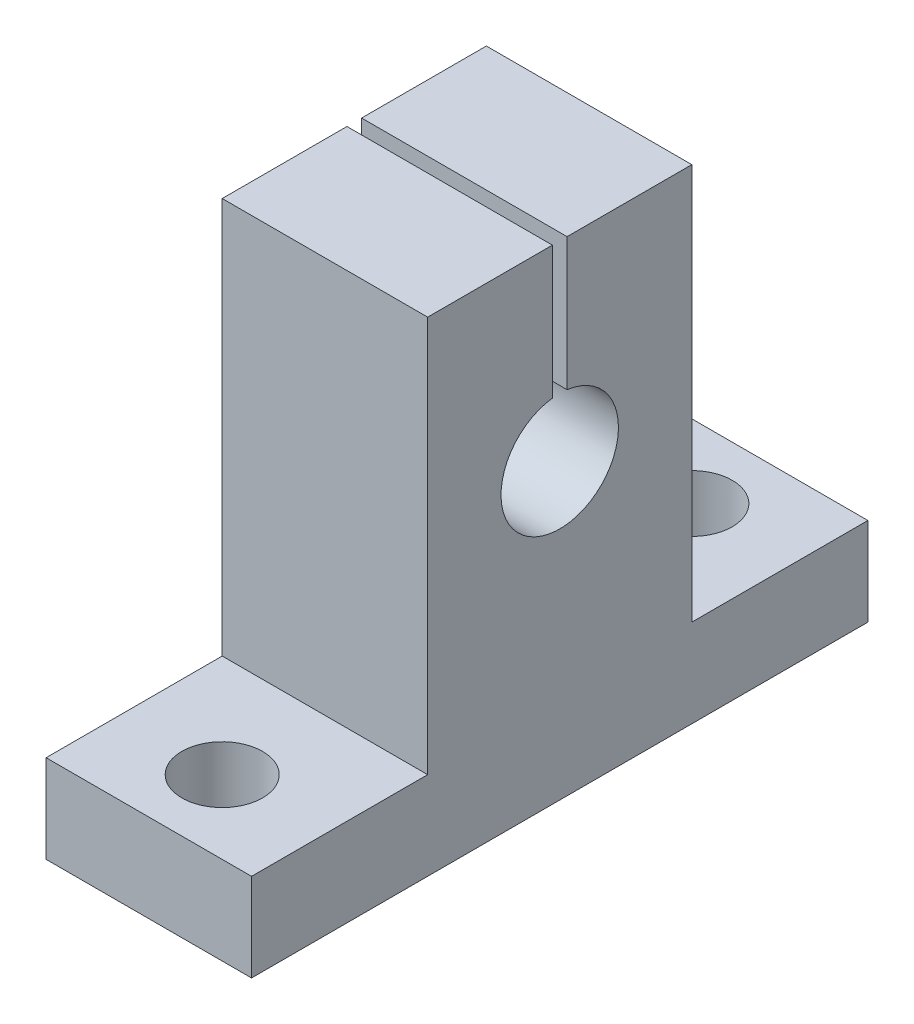
ISO-10303-21;
HEADER;
FILE_DESCRIPTION(('STEP AP214'),'2;1');
FILE_NAME('part.step','',(''),(''),'','','');
FILE_SCHEMA(('AUTOMOTIVE_DESIGN { 1 0 10303 214 1 1 1 1 }'));
ENDSEC;
DATA;
#1=APPLICATION_CONTEXT('core data for automotive mechanical design processes');
#2=APPLICATION_PROTOCOL_DEFINITION('international standard','automotive_design',2000,#1);
#3=PRODUCT_CONTEXT('',#1,'mechanical');
#4=PRODUCT('Part','Part','',(#3));
#5=PRODUCT_RELATED_PRODUCT_CATEGORY('part','',(#4));
#6=PRODUCT_DEFINITION_FORMATION('','',#4);
#7=PRODUCT_DEFINITION_CONTEXT('part definition',#1,'design');
#8=PRODUCT_DEFINITION('design','',#6,#7);
#9=PRODUCT_DEFINITION_SHAPE('','',#8);
#10=(LENGTH_UNIT() NAMED_UNIT(*) SI_UNIT(.MILLI.,.METRE.));
#11=(NAMED_UNIT(*) PLANE_ANGLE_UNIT() SI_UNIT($,.RADIAN.));
#12=(NAMED_UNIT(*) SI_UNIT($,.STERADIAN.) SOLID_ANGLE_UNIT());
#13=UNCERTAINTY_MEASURE_WITH_UNIT(LENGTH_MEASURE(1.E-05),#10,'distance_accuracy_value','');
#14=(GEOMETRIC_REPRESENTATION_CONTEXT(3) GLOBAL_UNCERTAINTY_ASSIGNED_CONTEXT((#13)) GLOBAL_UNIT_ASSIGNED_CONTEXT((#10,
#11,#12)) REPRESENTATION_CONTEXT('',''));
#15=CARTESIAN_POINT('',(0.,0.,0.));
#16=DIRECTION('',(0.,0.,1.));
#17=DIRECTION('',(1.,0.,0.));
#18=AXIS2_PLACEMENT_3D('',#15,#16,#17);
#19=CARTESIAN_POINT('',(14.,-20.,21.));
#20=DIRECTION('',(0.,0.,-1.));
#21=DIRECTION('',(-1.,0.,0.));
#22=AXIS2_PLACEMENT_3D('',#19,#20,#21);
#23=PLANE('',#22);
#24=DIRECTION('',(0.,-1.,0.));
#25=VECTOR('',#24,1.);
#26=CARTESIAN_POINT('',(0.,-20.,21.));
#27=LINE('',#26,#25);
#28=CARTESIAN_POINT('',(0.,-14.,21.));
#29=VERTEX_POINT('',#28);
#30=CARTESIAN_POINT('',(0.,-20.,21.));
#31=VERTEX_POINT('',#30);
#32=EDGE_CURVE('E154',#29,#31,#27,.T.);
#33=ORIENTED_EDGE('',*,*,#32,.T.);
#34=DIRECTION('',(-1.,0.,0.));
#35=VECTOR('',#34,1.);
#36=CARTESIAN_POINT('',(14.,-20.,21.));
#37=LINE('',#36,#35);
#38=CARTESIAN_POINT('',(14.,-20.,21.));
#39=VERTEX_POINT('',#38);
#40=EDGE_CURVE('E11',#39,#31,#37,.T.);
#41=ORIENTED_EDGE('',*,*,#40,.F.);
#42=DIRECTION('',(0.,-1.,0.));
#43=VECTOR('',#42,1.);
#44=CARTESIAN_POINT('',(14.,-20.,21.));
#45=LINE('',#44,#43);
#46=CARTESIAN_POINT('',(14.,-14.,21.));
#47=VERTEX_POINT('',#46);
#48=EDGE_CURVE('E176',#47,#39,#45,.T.);
#49=ORIENTED_EDGE('',*,*,#48,.F.);
#50=DIRECTION('',(-1.,0.,0.));
#51=VECTOR('',#50,1.);
#52=CARTESIAN_POINT('',(14.,-14.,21.));
#53=LINE('',#52,#51);
#54=EDGE_CURVE('E150',#47,#29,#53,.T.);
#55=ORIENTED_EDGE('',*,*,#54,.T.);
#56=EDGE_LOOP('',(#33,#41,#49,#55));
#57=FACE_BOUND('',#56,.T.);
#58=ADVANCED_FACE('F32',(#57),#23,.F.);
#59=CARTESIAN_POINT('',(14.,-20.,-21.));
#60=DIRECTION('',(0.,1.,0.));
#61=DIRECTION('',(0.,0.,1.));
#62=AXIS2_PLACEMENT_3D('',#59,#60,#61);
#63=PLANE('',#62);
#64=CARTESIAN_POINT('',(7.,-20.,-16.));
#65=DIRECTION('',(0.,1.,0.));
#66=DIRECTION('',(0.,0.,1.));
#67=AXIS2_PLACEMENT_3D('',#64,#65,#66);
#68=CIRCLE('',#67,2.75);
#69=CARTESIAN_POINT('',(7.,-20.,-13.25));
#70=VERTEX_POINT('',#69);
#71=EDGE_CURVE('E201',#70,#70,#68,.T.);
#72=ORIENTED_EDGE('',*,*,#71,.T.);
#73=EDGE_LOOP('',(#72));
#74=FACE_BOUND('',#73,.T.);
#75=CARTESIAN_POINT('',(7.,-20.,16.));
#76=DIRECTION('',(0.,1.,0.));
#77=DIRECTION('',(0.,0.,-1.));
#78=AXIS2_PLACEMENT_3D('',#75,#76,#77);
#79=CIRCLE('',#78,2.75);
#80=CARTESIAN_POINT('',(7.,-20.,13.25));
#81=VERTEX_POINT('',#80);
#82=EDGE_CURVE('E206',#81,#81,#79,.T.);
#83=ORIENTED_EDGE('',*,*,#82,.T.);
#84=EDGE_LOOP('',(#83));
#85=FACE_BOUND('',#84,.T.);
#86=DIRECTION('',(0.,0.,-1.));
#87=VECTOR('',#86,1.);
#88=CARTESIAN_POINT('',(0.,-20.,-21.));
#89=LINE('',#88,#87);
#90=CARTESIAN_POINT('',(0.,-20.,-21.));
#91=VERTEX_POINT('',#90);
#92=EDGE_CURVE('E157',#31,#91,#89,.T.);
#93=ORIENTED_EDGE('',*,*,#92,.T.);
#94=DIRECTION('',(-1.,0.,0.));
#95=VECTOR('',#94,1.);
#96=CARTESIAN_POINT('',(14.,-20.,-21.));
#97=LINE('',#96,#95);
#98=CARTESIAN_POINT('',(14.,-20.,-21.));
#99=VERTEX_POINT('',#98);
#100=EDGE_CURVE('E41',#99,#91,#97,.T.);
#101=ORIENTED_EDGE('',*,*,#100,.F.);
#102=DIRECTION('',(0.,0.,-1.));
#103=VECTOR('',#102,1.);
#104=CARTESIAN_POINT('',(14.,-20.,-21.));
#105=LINE('',#104,#103);
#106=EDGE_CURVE('E105',#39,#99,#105,.T.);
#107=ORIENTED_EDGE('',*,*,#106,.F.);
#108=ORIENTED_EDGE('',*,*,#40,.T.);
#109=EDGE_LOOP('',(#93,#101,#107,#108));
#110=FACE_BOUND('',#109,.T.);
#111=ADVANCED_FACE('F254',(#74,#85,#110),#63,.F.);
#112=CARTESIAN_POINT('',(14.,-20.,-21.));
#113=DIRECTION('',(0.,0.,1.));
#114=DIRECTION('',(1.,0.,0.));
#115=AXIS2_PLACEMENT_3D('',#112,#113,#114);
#116=PLANE('',#115);
#117=DIRECTION('',(0.,1.,0.));
#118=VECTOR('',#117,1.);
#119=CARTESIAN_POINT('',(0.,-20.,-21.));
#120=LINE('',#119,#118);
#121=CARTESIAN_POINT('',(0.,-14.,-21.));
#122=VERTEX_POINT('',#121);
#123=EDGE_CURVE('E159',#91,#122,#120,.T.);
#124=ORIENTED_EDGE('',*,*,#123,.T.);
#125=DIRECTION('',(-1.,0.,0.));
#126=VECTOR('',#125,1.);
#127=CARTESIAN_POINT('',(14.,-14.,-21.));
#128=LINE('',#127,#126);
#129=CARTESIAN_POINT('',(14.,-14.,-21.));
#130=VERTEX_POINT('',#129);
#131=EDGE_CURVE('E195',#130,#122,#128,.T.);
#132=ORIENTED_EDGE('',*,*,#131,.F.);
#133=DIRECTION('',(0.,1.,0.));
#134=VECTOR('',#133,1.);
#135=CARTESIAN_POINT('',(14.,-20.,-21.));
#136=LINE('',#135,#134);
#137=EDGE_CURVE('E215',#99,#130,#136,.T.);
#138=ORIENTED_EDGE('',*,*,#137,.F.);
#139=ORIENTED_EDGE('',*,*,#100,.T.);
#140=EDGE_LOOP('',(#124,#132,#138,#139));
#141=FACE_BOUND('',#140,.T.);
#142=ADVANCED_FACE('F258',(#141),#116,.F.);
#143=CARTESIAN_POINT('',(14.,-14.,-21.));
#144=DIRECTION('',(0.,-1.,0.));
#145=DIRECTION('',(0.,0.,-1.));
#146=AXIS2_PLACEMENT_3D('',#143,#144,#145);
#147=PLANE('',#146);
#148=CARTESIAN_POINT('',(7.,-14.,-16.));
#149=DIRECTION('',(0.,-1.,0.));
#150=DIRECTION('',(0.,0.,-1.));
#151=AXIS2_PLACEMENT_3D('',#148,#149,#150);
#152=CIRCLE('',#151,2.75);
#153=CARTESIAN_POINT('',(7.,-14.,-18.75));
#154=VERTEX_POINT('',#153);
#155=EDGE_CURVE('E35',#154,#154,#152,.T.);
#156=ORIENTED_EDGE('',*,*,#155,.T.);
#157=EDGE_LOOP('',(#156));
#158=FACE_BOUND('',#157,.T.);
#159=DIRECTION('',(0.,0.,1.));
#160=VECTOR('',#159,1.);
#161=CARTESIAN_POINT('',(0.,-14.,-21.));
#162=LINE('',#161,#160);
#163=CARTESIAN_POINT('',(0.,-14.,-9.));
#164=VERTEX_POINT('',#163);
#165=EDGE_CURVE('E161',#122,#164,#162,.T.);
#166=ORIENTED_EDGE('',*,*,#165,.T.);
#167=DIRECTION('',(-1.,0.,0.));
#168=VECTOR('',#167,1.);
#169=CARTESIAN_POINT('',(14.,-14.,-9.));
#170=LINE('',#169,#168);
#171=CARTESIAN_POINT('',(14.,-14.,-9.));
#172=VERTEX_POINT('',#171);
#173=EDGE_CURVE('E192',#172,#164,#170,.T.);
#174=ORIENTED_EDGE('',*,*,#173,.F.);
#175=DIRECTION('',(0.,0.,1.));
#176=VECTOR('',#175,1.);
#177=CARTESIAN_POINT('',(14.,-14.,-21.));
#178=LINE('',#177,#176);
#179=EDGE_CURVE('E217',#130,#172,#178,.T.);
#180=ORIENTED_EDGE('',*,*,#179,.F.);
#181=ORIENTED_EDGE('',*,*,#131,.T.);
#182=EDGE_LOOP('',(#166,#174,#180,#181));
#183=FACE_BOUND('',#182,.T.);
#184=ADVANCED_FACE('F262',(#158,#183),#147,.F.);
#185=CARTESIAN_POINT('',(14.,-14.,-9.));
#186=DIRECTION('',(0.,0.,1.));
#187=DIRECTION('',(1.,0.,0.));
#188=AXIS2_PLACEMENT_3D('',#185,#186,#187);
#189=PLANE('',#188);
#190=DIRECTION('',(0.,1.,0.));
#191=VECTOR('',#190,1.);
#192=CARTESIAN_POINT('',(0.,-14.,-9.));
#193=LINE('',#192,#191);
#194=CARTESIAN_POINT('',(0.,13.,-9.));
#195=VERTEX_POINT('',#194);
#196=EDGE_CURVE('E163',#164,#195,#193,.T.);
#197=ORIENTED_EDGE('',*,*,#196,.T.);
#198=DIRECTION('',(-1.,0.,0.));
#199=VECTOR('',#198,1.);
#200=CARTESIAN_POINT('',(14.,13.,-9.));
#201=LINE('',#200,#199);
#202=CARTESIAN_POINT('',(14.,13.,-9.));
#203=VERTEX_POINT('',#202);
#204=EDGE_CURVE('E189',#203,#195,#201,.T.);
#205=ORIENTED_EDGE('',*,*,#204,.F.);
#206=DIRECTION('',(0.,1.,0.));
#207=VECTOR('',#206,1.);
#208=CARTESIAN_POINT('',(14.,-14.,-9.));
#209=LINE('',#208,#207);
#210=EDGE_CURVE('E219',#172,#203,#209,.T.);
#211=ORIENTED_EDGE('',*,*,#210,.F.);
#212=ORIENTED_EDGE('',*,*,#173,.T.);
#213=EDGE_LOOP('',(#197,#205,#211,#212));
#214=FACE_BOUND('',#213,.T.);
#215=ADVANCED_FACE('F269',(#214),#189,.F.);
#216=CARTESIAN_POINT('',(14.,13.,-9.));
#217=DIRECTION('',(0.,-1.,0.));
#218=DIRECTION('',(0.,0.,-1.));
#219=AXIS2_PLACEMENT_3D('',#216,#217,#218);
#220=PLANE('',#219);
#221=DIRECTION('',(0.,0.,1.));
#222=VECTOR('',#221,1.);
#223=CARTESIAN_POINT('',(0.,13.,-9.));
#224=LINE('',#223,#222);
#225=CARTESIAN_POINT('',(0.,13.,-0.5));
#226=VERTEX_POINT('',#225);
#227=EDGE_CURVE('E165',#195,#226,#224,.T.);
#228=ORIENTED_EDGE('',*,*,#227,.T.);
#229=DIRECTION('',(-1.,0.,0.));
#230=VECTOR('',#229,1.);
#231=CARTESIAN_POINT('',(14.,13.,-0.5));
#232=LINE('',#231,#230);
#233=CARTESIAN_POINT('',(14.,13.,-0.5));
#234=VERTEX_POINT('',#233);
#235=EDGE_CURVE('E186',#234,#226,#232,.T.);
#236=ORIENTED_EDGE('',*,*,#235,.F.);
#237=DIRECTION('',(0.,0.,1.));
#238=VECTOR('',#237,1.);
#239=CARTESIAN_POINT('',(14.,13.,-9.));
#240=LINE('',#239,#238);
#241=EDGE_CURVE('E221',#203,#234,#240,.T.);
#242=ORIENTED_EDGE('',*,*,#241,.F.);
#243=ORIENTED_EDGE('',*,*,#204,.T.);
#244=EDGE_LOOP('',(#228,#236,#242,#243));
#245=FACE_BOUND('',#244,.T.);
#246=ADVANCED_FACE('F273',(#245),#220,.F.);
#247=CARTESIAN_POINT('',(14.,13.,-0.5));
#248=DIRECTION('',(0.,0.,-1.));
#249=DIRECTION('',(0.,1.,0.));
#250=AXIS2_PLACEMENT_3D('',#247,#248,#249);
#251=PLANE('',#250);
#252=DIRECTION('',(0.,-1.,0.));
#253=VECTOR('',#252,1.);
#254=CARTESIAN_POINT('',(0.,13.,-0.5));
#255=LINE('',#254,#253);
#256=CARTESIAN_POINT('',(0.,3.96862696659689,-0.499999999999999));
#257=VERTEX_POINT('',#256);
#258=EDGE_CURVE('E167',#226,#257,#255,.T.);
#259=ORIENTED_EDGE('',*,*,#258,.T.);
#260=DIRECTION('',(-1.,0.,0.));
#261=VECTOR('',#260,1.);
#262=CARTESIAN_POINT('',(14.,3.96862696659689,-0.499999999999999));
#263=LINE('',#262,#261);
#264=CARTESIAN_POINT('',(14.,3.96862696659689,-0.499999999999999));
#265=VERTEX_POINT('',#264);
#266=EDGE_CURVE('E183',#265,#257,#263,.T.);
#267=ORIENTED_EDGE('',*,*,#266,.F.);
#268=DIRECTION('',(0.,-1.,0.));
#269=VECTOR('',#268,1.);
#270=CARTESIAN_POINT('',(14.,13.,-0.5));
#271=LINE('',#270,#269);
#272=EDGE_CURVE('E223',#234,#265,#271,.T.);
#273=ORIENTED_EDGE('',*,*,#272,.F.);
#274=ORIENTED_EDGE('',*,*,#235,.T.);
#275=EDGE_LOOP('',(#259,#267,#273,#274));
#276=FACE_BOUND('',#275,.T.);
#277=ADVANCED_FACE('F277',(#276),#251,.F.);
#278=CARTESIAN_POINT('',(14.,0.,0.));
#279=DIRECTION('',(-1.,0.,0.));
#280=DIRECTION('',(0.,0.,1.));
#281=AXIS2_PLACEMENT_3D('',#278,#279,#280);
#282=CYLINDRICAL_SURFACE('',#281,4.);
#283=CARTESIAN_POINT('',(0.,0.,0.));
#284=DIRECTION('',(-1.,0.,0.));
#285=DIRECTION('',(0.,0.,-1.));
#286=AXIS2_PLACEMENT_3D('',#283,#284,#285);
#287=CIRCLE('',#286,4.);
#288=CARTESIAN_POINT('',(0.,3.96862696659689,0.499999999999999));
#289=VERTEX_POINT('',#288);
#290=EDGE_CURVE('E169',#257,#289,#287,.T.);
#291=ORIENTED_EDGE('',*,*,#290,.T.);
#292=DIRECTION('',(-1.,0.,0.));
#293=VECTOR('',#292,1.);
#294=CARTESIAN_POINT('',(14.,3.96862696659689,0.499999999999999));
#295=LINE('',#294,#293);
#296=CARTESIAN_POINT('',(14.,3.96862696659689,0.499999999999999));
#297=VERTEX_POINT('',#296);
#298=EDGE_CURVE('E180',#297,#289,#295,.T.);
#299=ORIENTED_EDGE('',*,*,#298,.F.);
#300=CARTESIAN_POINT('',(14.,0.,0.));
#301=DIRECTION('',(-1.,0.,0.));
#302=DIRECTION('',(0.,0.,-1.));
#303=AXIS2_PLACEMENT_3D('',#300,#301,#302);
#304=CIRCLE('',#303,4.);
#305=EDGE_CURVE('E225',#265,#297,#304,.T.);
#306=ORIENTED_EDGE('',*,*,#305,.F.);
#307=ORIENTED_EDGE('',*,*,#266,.T.);
#308=EDGE_LOOP('',(#291,#299,#306,#307));
#309=FACE_BOUND('',#308,.T.);
#310=ADVANCED_FACE('F231',(#309),#282,.F.);
#311=CARTESIAN_POINT('',(14.,13.,0.5));
#312=DIRECTION('',(0.,0.,1.));
#313=DIRECTION('',(0.,-1.,0.));
#314=AXIS2_PLACEMENT_3D('',#311,#312,#313);
#315=PLANE('',#314);
#316=DIRECTION('',(0.,1.,0.));
#317=VECTOR('',#316,1.);
#318=CARTESIAN_POINT('',(0.,13.,0.5));
#319=LINE('',#318,#317);
#320=CARTESIAN_POINT('',(0.,13.,0.5));
#321=VERTEX_POINT('',#320);
#322=EDGE_CURVE('E171',#289,#321,#319,.T.);
#323=ORIENTED_EDGE('',*,*,#322,.T.);
#324=DIRECTION('',(-1.,0.,0.));
#325=VECTOR('',#324,1.);
#326=CARTESIAN_POINT('',(14.,13.,0.5));
#327=LINE('',#326,#325);
#328=CARTESIAN_POINT('',(14.,13.,0.5));
#329=VERTEX_POINT('',#328);
#330=EDGE_CURVE('E145',#329,#321,#327,.T.);
#331=ORIENTED_EDGE('',*,*,#330,.F.);
#332=DIRECTION('',(0.,1.,0.));
#333=VECTOR('',#332,1.);
#334=CARTESIAN_POINT('',(14.,13.,0.5));
#335=LINE('',#334,#333);
#336=EDGE_CURVE('E136',#297,#329,#335,.T.);
#337=ORIENTED_EDGE('',*,*,#336,.F.);
#338=ORIENTED_EDGE('',*,*,#298,.T.);
#339=EDGE_LOOP('',(#323,#331,#337,#338));
#340=FACE_BOUND('',#339,.T.);
#341=ADVANCED_FACE('F235',(#340),#315,.F.);
#342=CARTESIAN_POINT('',(14.,13.,9.));
#343=DIRECTION('',(0.,-1.,0.));
#344=DIRECTION('',(0.,0.,-1.));
#345=AXIS2_PLACEMENT_3D('',#342,#343,#344);
#346=PLANE('',#345);
#347=DIRECTION('',(0.,0.,1.));
#348=VECTOR('',#347,1.);
#349=CARTESIAN_POINT('',(0.,13.,9.));
#350=LINE('',#349,#348);
#351=CARTESIAN_POINT('',(0.,13.,9.));
#352=VERTEX_POINT('',#351);
#353=EDGE_CURVE('E144',#321,#352,#350,.T.);
#354=ORIENTED_EDGE('',*,*,#353,.T.);
#355=DIRECTION('',(-1.,0.,0.));
#356=VECTOR('',#355,1.);
#357=CARTESIAN_POINT('',(14.,13.,9.));
#358=LINE('',#357,#356);
#359=CARTESIAN_POINT('',(14.,13.,9.));
#360=VERTEX_POINT('',#359);
#361=EDGE_CURVE('E141',#360,#352,#358,.T.);
#362=ORIENTED_EDGE('',*,*,#361,.F.);
#363=DIRECTION('',(0.,0.,1.));
#364=VECTOR('',#363,1.);
#365=CARTESIAN_POINT('',(14.,13.,9.));
#366=LINE('',#365,#364);
#367=EDGE_CURVE('E130',#329,#360,#366,.T.);
#368=ORIENTED_EDGE('',*,*,#367,.F.);
#369=ORIENTED_EDGE('',*,*,#330,.T.);
#370=EDGE_LOOP('',(#354,#362,#368,#369));
#371=FACE_BOUND('',#370,.T.);
#372=ADVANCED_FACE('F142',(#371),#346,.F.);
#373=CARTESIAN_POINT('',(14.,-14.,9.));
#374=DIRECTION('',(0.,0.,-1.));
#375=DIRECTION('',(-1.,0.,0.));
#376=AXIS2_PLACEMENT_3D('',#373,#374,#375);
#377=PLANE('',#376);
#378=DIRECTION('',(0.,-1.,0.));
#379=VECTOR('',#378,1.);
#380=CARTESIAN_POINT('',(0.,-14.,9.));
#381=LINE('',#380,#379);
#382=CARTESIAN_POINT('',(0.,-14.,9.));
#383=VERTEX_POINT('',#382);
#384=EDGE_CURVE('E91',#352,#383,#381,.T.);
#385=ORIENTED_EDGE('',*,*,#384,.T.);
#386=DIRECTION('',(-1.,0.,0.));
#387=VECTOR('',#386,1.);
#388=CARTESIAN_POINT('',(14.,-14.,9.));
#389=LINE('',#388,#387);
#390=CARTESIAN_POINT('',(14.,-14.,9.));
#391=VERTEX_POINT('',#390);
#392=EDGE_CURVE('E146',#391,#383,#389,.T.);
#393=ORIENTED_EDGE('',*,*,#392,.F.);
#394=DIRECTION('',(0.,-1.,0.));
#395=VECTOR('',#394,1.);
#396=CARTESIAN_POINT('',(14.,-14.,9.));
#397=LINE('',#396,#395);
#398=EDGE_CURVE('E134',#360,#391,#397,.T.);
#399=ORIENTED_EDGE('',*,*,#398,.F.);
#400=ORIENTED_EDGE('',*,*,#361,.T.);
#401=EDGE_LOOP('',(#385,#393,#399,#400));
#402=FACE_BOUND('',#401,.T.);
#403=ADVANCED_FACE('F148',(#402),#377,.F.);
#404=CARTESIAN_POINT('',(14.,-14.,21.));
#405=DIRECTION('',(0.,-1.,0.));
#406=DIRECTION('',(0.,0.,-1.));
#407=AXIS2_PLACEMENT_3D('',#404,#405,#406);
#408=PLANE('',#407);
#409=CARTESIAN_POINT('',(7.,-14.,16.));
#410=DIRECTION('',(0.,-1.,0.));
#411=DIRECTION('',(0.,0.,-1.));
#412=AXIS2_PLACEMENT_3D('',#409,#410,#411);
#413=CIRCLE('',#412,2.75);
#414=CARTESIAN_POINT('',(7.,-14.,13.25));
#415=VERTEX_POINT('',#414);
#416=EDGE_CURVE('E199',#415,#415,#413,.T.);
#417=ORIENTED_EDGE('',*,*,#416,.T.);
#418=EDGE_LOOP('',(#417));
#419=FACE_BOUND('',#418,.T.);
#420=DIRECTION('',(0.,0.,1.));
#421=VECTOR('',#420,1.);
#422=CARTESIAN_POINT('',(0.,-14.,21.));
#423=LINE('',#422,#421);
#424=EDGE_CURVE('E97',#383,#29,#423,.T.);
#425=ORIENTED_EDGE('',*,*,#424,.T.);
#426=ORIENTED_EDGE('',*,*,#54,.F.);
#427=DIRECTION('',(0.,0.,1.));
#428=VECTOR('',#427,1.);
#429=CARTESIAN_POINT('',(14.,-14.,21.));
#430=LINE('',#429,#428);
#431=EDGE_CURVE('E50',#391,#47,#430,.T.);
#432=ORIENTED_EDGE('',*,*,#431,.F.);
#433=ORIENTED_EDGE('',*,*,#392,.T.);
#434=EDGE_LOOP('',(#425,#426,#432,#433));
#435=FACE_BOUND('',#434,.T.);
#436=ADVANCED_FACE('F243',(#419,#435),#408,.F.);
#437=CARTESIAN_POINT('',(14.,0.,0.));
#438=DIRECTION('',(1.,0.,0.));
#439=DIRECTION('',(0.,0.,-1.));
#440=AXIS2_PLACEMENT_3D('',#437,#438,#439);
#441=PLANE('',#440);
#442=ORIENTED_EDGE('',*,*,#48,.T.);
#443=ORIENTED_EDGE('',*,*,#106,.T.);
#444=ORIENTED_EDGE('',*,*,#137,.T.);
#445=ORIENTED_EDGE('',*,*,#179,.T.);
#446=ORIENTED_EDGE('',*,*,#210,.T.);
#447=ORIENTED_EDGE('',*,*,#241,.T.);
#448=ORIENTED_EDGE('',*,*,#272,.T.);
#449=ORIENTED_EDGE('',*,*,#305,.T.);
#450=ORIENTED_EDGE('',*,*,#336,.T.);
#451=ORIENTED_EDGE('',*,*,#367,.T.);
#452=ORIENTED_EDGE('',*,*,#398,.T.);
#453=ORIENTED_EDGE('',*,*,#431,.T.);
#454=EDGE_LOOP('',(#442,#443,#444,#445,#446,#447,#448,#449,#450,#451,#452,#453));
#455=FACE_BOUND('',#454,.T.);
#456=ADVANCED_FACE('F132',(#455),#441,.T.);
#457=CARTESIAN_POINT('',(0.,0.,0.));
#458=DIRECTION('',(1.,0.,0.));
#459=DIRECTION('',(0.,0.,-1.));
#460=AXIS2_PLACEMENT_3D('',#457,#458,#459);
#461=PLANE('',#460);
#462=ORIENTED_EDGE('',*,*,#32,.F.);
#463=ORIENTED_EDGE('',*,*,#424,.F.);
#464=ORIENTED_EDGE('',*,*,#384,.F.);
#465=ORIENTED_EDGE('',*,*,#353,.F.);
#466=ORIENTED_EDGE('',*,*,#322,.F.);
#467=ORIENTED_EDGE('',*,*,#290,.F.);
#468=ORIENTED_EDGE('',*,*,#258,.F.);
#469=ORIENTED_EDGE('',*,*,#227,.F.);
#470=ORIENTED_EDGE('',*,*,#196,.F.);
#471=ORIENTED_EDGE('',*,*,#165,.F.);
#472=ORIENTED_EDGE('',*,*,#123,.F.);
#473=ORIENTED_EDGE('',*,*,#92,.F.);
#474=EDGE_LOOP('',(#462,#463,#464,#465,#466,#467,#468,#469,#470,#471,#472,#473));
#475=FACE_BOUND('',#474,.T.);
#476=ADVANCED_FACE('F238',(#475),#461,.F.);
#477=CARTESIAN_POINT('',(7.,-20.,16.));
#478=DIRECTION('',(0.,1.,0.));
#479=DIRECTION('',(0.,0.,1.));
#480=AXIS2_PLACEMENT_3D('',#477,#478,#479);
#481=CYLINDRICAL_SURFACE('',#480,2.75);
#482=ORIENTED_EDGE('',*,*,#82,.F.);
#483=EDGE_LOOP('',(#482));
#484=FACE_BOUND('',#483,.T.);
#485=ORIENTED_EDGE('',*,*,#416,.F.);
#486=EDGE_LOOP('',(#485));
#487=FACE_BOUND('',#486,.T.);
#488=ADVANCED_FACE('F310',(#484,#487),#481,.F.);
#489=CARTESIAN_POINT('',(7.,-20.,-16.));
#490=DIRECTION('',(0.,1.,0.));
#491=DIRECTION('',(0.,0.,1.));
#492=AXIS2_PLACEMENT_3D('',#489,#490,#491);
#493=CYLINDRICAL_SURFACE('',#492,2.75);
#494=ORIENTED_EDGE('',*,*,#71,.F.);
#495=EDGE_LOOP('',(#494));
#496=FACE_BOUND('',#495,.T.);
#497=ORIENTED_EDGE('',*,*,#155,.F.);
#498=EDGE_LOOP('',(#497));
#499=FACE_BOUND('',#498,.T.);
#500=ADVANCED_FACE('F335',(#496,#499),#493,.F.);
#501=CLOSED_SHELL('',(#58,#111,#142,#184,#215,#246,#277,#310,#341,#372,#403,#436,#456,#476,#488,#500));
#502=MANIFOLD_SOLID_BREP('B2',#501);
#503=ADVANCED_BREP_SHAPE_REPRESENTATION('',(#18,#502),#14);
#504=SHAPE_DEFINITION_REPRESENTATION(#9,#503);
ENDSEC;
END-ISO-10303-21;
